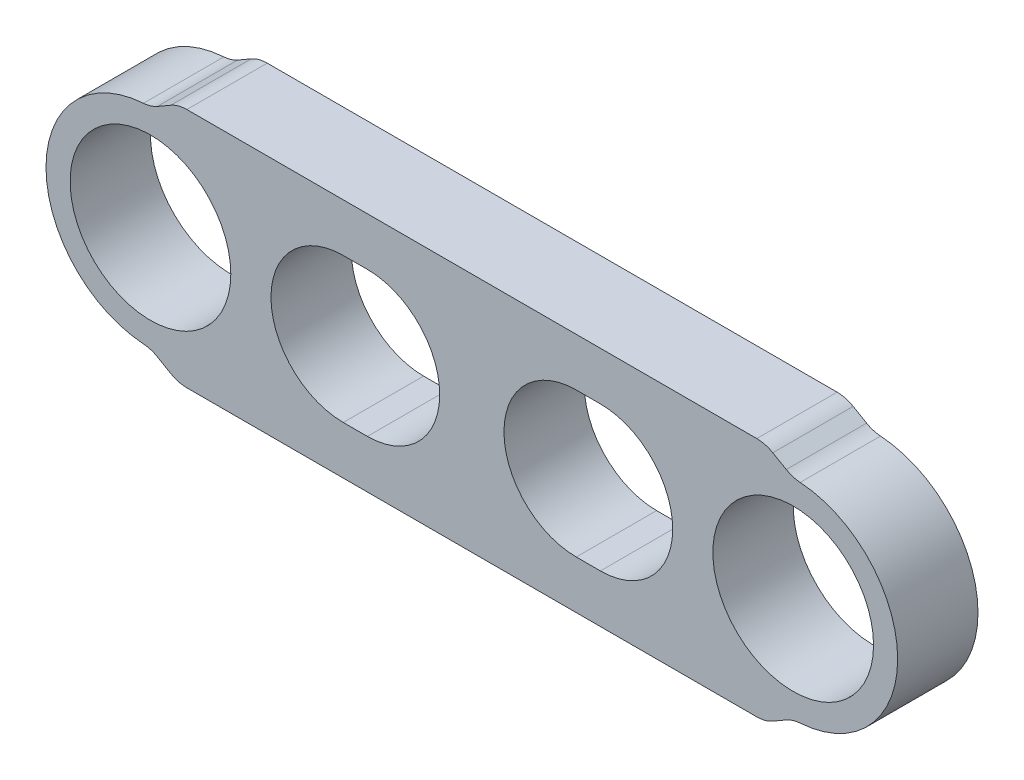
ISO-10303-21;
HEADER;
FILE_DESCRIPTION(('STEP AP214'),'2;1');
FILE_NAME('part.step','',(''),(''),'','','');
FILE_SCHEMA(('AUTOMOTIVE_DESIGN { 1 0 10303 214 1 1 1 1 }'));
ENDSEC;
DATA;
#1=APPLICATION_CONTEXT('core data for automotive mechanical design processes');
#2=APPLICATION_PROTOCOL_DEFINITION('international standard','automotive_design',2000,#1);
#3=PRODUCT_CONTEXT('',#1,'mechanical');
#4=PRODUCT('Part','Part','',(#3));
#5=PRODUCT_RELATED_PRODUCT_CATEGORY('part','',(#4));
#6=PRODUCT_DEFINITION_FORMATION('','',#4);
#7=PRODUCT_DEFINITION_CONTEXT('part definition',#1,'design');
#8=PRODUCT_DEFINITION('design','',#6,#7);
#9=PRODUCT_DEFINITION_SHAPE('','',#8);
#10=(LENGTH_UNIT() NAMED_UNIT(*) SI_UNIT(.MILLI.,.METRE.));
#11=(NAMED_UNIT(*) PLANE_ANGLE_UNIT() SI_UNIT($,.RADIAN.));
#12=(NAMED_UNIT(*) SI_UNIT($,.STERADIAN.) SOLID_ANGLE_UNIT());
#13=UNCERTAINTY_MEASURE_WITH_UNIT(LENGTH_MEASURE(1.E-05),#10,'distance_accuracy_value','');
#14=(GEOMETRIC_REPRESENTATION_CONTEXT(3) GLOBAL_UNCERTAINTY_ASSIGNED_CONTEXT((#13)) GLOBAL_UNIT_ASSIGNED_CONTEXT((#10,
#11,#12)) REPRESENTATION_CONTEXT('',''));
#15=CARTESIAN_POINT('',(0.,0.,0.));
#16=DIRECTION('',(0.,0.,1.));
#17=DIRECTION('',(1.,0.,0.));
#18=AXIS2_PLACEMENT_3D('',#15,#16,#17);
#19=CARTESIAN_POINT('',(0.,-7.5,5.));
#20=DIRECTION('',(0.,1.,0.));
#21=DIRECTION('',(0.,0.,1.));
#22=AXIS2_PLACEMENT_3D('',#19,#20,#21);
#23=PLANE('',#22);
#24=DIRECTION('',(1.,0.,0.));
#25=VECTOR('',#24,1.);
#26=CARTESIAN_POINT('',(0.,-7.5,5.));
#27=LINE('',#26,#25);
#28=CARTESIAN_POINT('',(2.26794919243111,-7.5,5.));
#29=VERTEX_POINT('',#28);
#30=CARTESIAN_POINT('',(37.7320508075689,-7.5,5.));
#31=VERTEX_POINT('',#30);
#32=EDGE_CURVE('E303',#29,#31,#27,.T.);
#33=ORIENTED_EDGE('',*,*,#32,.F.);
#34=DIRECTION('',(0.,0.,1.));
#35=VECTOR('',#34,1.);
#36=CARTESIAN_POINT('',(2.26794919243111,-7.5,0.));
#37=LINE('',#36,#35);
#38=CARTESIAN_POINT('',(2.26794919243111,-7.5,0.));
#39=VERTEX_POINT('',#38);
#40=EDGE_CURVE('E355',#29,#39,#37,.F.);
#41=ORIENTED_EDGE('',*,*,#40,.T.);
#42=DIRECTION('',(1.,0.,0.));
#43=VECTOR('',#42,1.);
#44=CARTESIAN_POINT('',(0.,-7.5,0.));
#45=LINE('',#44,#43);
#46=CARTESIAN_POINT('',(37.7320508075689,-7.5,0.));
#47=VERTEX_POINT('',#46);
#48=EDGE_CURVE('E278',#39,#47,#45,.T.);
#49=ORIENTED_EDGE('',*,*,#48,.T.);
#50=DIRECTION('',(0.,0.,1.));
#51=VECTOR('',#50,1.);
#52=CARTESIAN_POINT('',(37.7320508075689,-7.5,5.));
#53=LINE('',#52,#51);
#54=EDGE_CURVE('E352',#47,#31,#53,.T.);
#55=ORIENTED_EDGE('',*,*,#54,.T.);
#56=EDGE_LOOP('',(#33,#41,#49,#55));
#57=FACE_BOUND('',#56,.T.);
#58=ADVANCED_FACE('F44',(#57),#23,.F.);
#59=CARTESIAN_POINT('',(0.,7.5,5.));
#60=DIRECTION('',(0.,-1.,0.));
#61=DIRECTION('',(0.,0.,-1.));
#62=AXIS2_PLACEMENT_3D('',#59,#60,#61);
#63=PLANE('',#62);
#64=DIRECTION('',(-1.,0.,0.));
#65=VECTOR('',#64,1.);
#66=CARTESIAN_POINT('',(0.,7.5,5.));
#67=LINE('',#66,#65);
#68=CARTESIAN_POINT('',(37.7320508075689,7.5,5.));
#69=VERTEX_POINT('',#68);
#70=CARTESIAN_POINT('',(2.26794919243111,7.5,5.));
#71=VERTEX_POINT('',#70);
#72=EDGE_CURVE('E306',#69,#71,#67,.T.);
#73=ORIENTED_EDGE('',*,*,#72,.F.);
#74=DIRECTION('',(0.,0.,1.));
#75=VECTOR('',#74,1.);
#76=CARTESIAN_POINT('',(37.7320508075689,7.5,0.));
#77=LINE('',#76,#75);
#78=CARTESIAN_POINT('',(37.7320508075689,7.5,0.));
#79=VERTEX_POINT('',#78);
#80=EDGE_CURVE('E382',#69,#79,#77,.F.);
#81=ORIENTED_EDGE('',*,*,#80,.T.);
#82=DIRECTION('',(-1.,0.,0.));
#83=VECTOR('',#82,1.);
#84=CARTESIAN_POINT('',(0.,7.5,0.));
#85=LINE('',#84,#83);
#86=CARTESIAN_POINT('',(2.26794919243111,7.5,0.));
#87=VERTEX_POINT('',#86);
#88=EDGE_CURVE('E307',#79,#87,#85,.T.);
#89=ORIENTED_EDGE('',*,*,#88,.T.);
#90=DIRECTION('',(0.,0.,1.));
#91=VECTOR('',#90,1.);
#92=CARTESIAN_POINT('',(2.26794919243111,7.5,5.));
#93=LINE('',#92,#91);
#94=EDGE_CURVE('E379',#87,#71,#93,.T.);
#95=ORIENTED_EDGE('',*,*,#94,.T.);
#96=EDGE_LOOP('',(#73,#81,#89,#95));
#97=FACE_BOUND('',#96,.T.);
#98=ADVANCED_FACE('F438',(#97),#63,.F.);
#99=CARTESIAN_POINT('',(0.,0.,5.));
#100=DIRECTION('',(0.,0.,1.));
#101=DIRECTION('',(1.,0.,0.));
#102=AXIS2_PLACEMENT_3D('',#99,#100,#101);
#103=PLANE('',#102);
#104=CARTESIAN_POINT('',(12.,0.,5.));
#105=DIRECTION('',(0.,0.,1.));
#106=DIRECTION('',(1.,0.,0.));
#107=AXIS2_PLACEMENT_3D('',#104,#105,#106);
#108=CIRCLE('',#107,4.5);
#109=CARTESIAN_POINT('',(12.,4.5,5.));
#110=VERTEX_POINT('',#109);
#111=CARTESIAN_POINT('',(12.,-4.5,5.));
#112=VERTEX_POINT('',#111);
#113=EDGE_CURVE('E227',#110,#112,#108,.T.);
#114=ORIENTED_EDGE('',*,*,#113,.F.);
#115=DIRECTION('',(-1.,0.,0.));
#116=VECTOR('',#115,1.);
#117=CARTESIAN_POINT('',(12.,4.5,5.));
#118=LINE('',#117,#116);
#119=CARTESIAN_POINT('',(13.5,4.5,5.));
#120=VERTEX_POINT('',#119);
#121=EDGE_CURVE('E232',#120,#110,#118,.T.);
#122=ORIENTED_EDGE('',*,*,#121,.F.);
#123=CARTESIAN_POINT('',(13.5,0.,5.));
#124=DIRECTION('',(0.,0.,1.));
#125=DIRECTION('',(1.,0.,0.));
#126=AXIS2_PLACEMENT_3D('',#123,#124,#125);
#127=CIRCLE('',#126,4.5);
#128=CARTESIAN_POINT('',(13.5,-4.5,5.));
#129=VERTEX_POINT('',#128);
#130=EDGE_CURVE('E211',#129,#120,#127,.T.);
#131=ORIENTED_EDGE('',*,*,#130,.F.);
#132=DIRECTION('',(1.,0.,0.));
#133=VECTOR('',#132,1.);
#134=CARTESIAN_POINT('',(12.,-4.5,5.));
#135=LINE('',#134,#133);
#136=EDGE_CURVE('E222',#112,#129,#135,.T.);
#137=ORIENTED_EDGE('',*,*,#136,.F.);
#138=EDGE_LOOP('',(#114,#122,#131,#137));
#139=FACE_BOUND('',#138,.T.);
#140=CARTESIAN_POINT('',(28.,0.,5.));
#141=DIRECTION('',(0.,0.,1.));
#142=DIRECTION('',(-1.,0.,0.));
#143=AXIS2_PLACEMENT_3D('',#140,#141,#142);
#144=CIRCLE('',#143,4.5);
#145=CARTESIAN_POINT('',(28.,-4.5,5.));
#146=VERTEX_POINT('',#145);
#147=CARTESIAN_POINT('',(28.,4.5,5.));
#148=VERTEX_POINT('',#147);
#149=EDGE_CURVE('E260',#146,#148,#144,.T.);
#150=ORIENTED_EDGE('',*,*,#149,.F.);
#151=DIRECTION('',(1.,0.,0.));
#152=VECTOR('',#151,1.);
#153=CARTESIAN_POINT('',(28.,-4.5,5.));
#154=LINE('',#153,#152);
#155=CARTESIAN_POINT('',(26.5,-4.5,5.));
#156=VERTEX_POINT('',#155);
#157=EDGE_CURVE('E245',#156,#146,#154,.T.);
#158=ORIENTED_EDGE('',*,*,#157,.F.);
#159=CARTESIAN_POINT('',(26.5,0.,5.));
#160=DIRECTION('',(0.,0.,1.));
#161=DIRECTION('',(-1.,0.,0.));
#162=AXIS2_PLACEMENT_3D('',#159,#160,#161);
#163=CIRCLE('',#162,4.5);
#164=CARTESIAN_POINT('',(26.5,4.5,5.));
#165=VERTEX_POINT('',#164);
#166=EDGE_CURVE('E254',#165,#156,#163,.T.);
#167=ORIENTED_EDGE('',*,*,#166,.F.);
#168=DIRECTION('',(-1.,0.,0.));
#169=VECTOR('',#168,1.);
#170=CARTESIAN_POINT('',(28.,4.5,5.));
#171=LINE('',#170,#169);
#172=EDGE_CURVE('E257',#148,#165,#171,.T.);
#173=ORIENTED_EDGE('',*,*,#172,.F.);
#174=EDGE_LOOP('',(#150,#158,#167,#173));
#175=FACE_BOUND('',#174,.T.);
#176=CARTESIAN_POINT('',(0.,0.,5.));
#177=DIRECTION('',(0.,0.,1.));
#178=DIRECTION('',(1.,0.,0.));
#179=AXIS2_PLACEMENT_3D('',#176,#177,#178);
#180=CIRCLE('',#179,5.);
#181=CARTESIAN_POINT('',(5.,0.,5.));
#182=VERTEX_POINT('',#181);
#183=EDGE_CURVE('E262',#182,#182,#180,.T.);
#184=ORIENTED_EDGE('',*,*,#183,.F.);
#185=EDGE_LOOP('',(#184));
#186=FACE_BOUND('',#185,.T.);
#187=CARTESIAN_POINT('',(40.,0.,5.));
#188=DIRECTION('',(0.,0.,1.));
#189=DIRECTION('',(1.,0.,0.));
#190=AXIS2_PLACEMENT_3D('',#187,#188,#189);
#191=CIRCLE('',#190,5.);
#192=CARTESIAN_POINT('',(45.,0.,5.));
#193=VERTEX_POINT('',#192);
#194=EDGE_CURVE('E239',#193,#193,#191,.T.);
#195=ORIENTED_EDGE('',*,*,#194,.F.);
#196=EDGE_LOOP('',(#195));
#197=FACE_BOUND('',#196,.T.);
#198=DIRECTION('',(0.866025403784436,-0.500000000000005,0.));
#199=VECTOR('',#198,1.);
#200=CARTESIAN_POINT('',(-2.81458256229944,-4.87499999999997,5.));
#201=LINE('',#200,#199);
#202=CARTESIAN_POINT('',(0.431088343107263,-6.74888897093749,5.));
#203=VERTEX_POINT('',#202);
#204=CARTESIAN_POINT('',(1.2679491924311,-7.23205080756887,5.));
#205=VERTEX_POINT('',#204);
#206=EDGE_CURVE('E272',#203,#205,#201,.T.);
#207=ORIENTED_EDGE('',*,*,#206,.T.);
#208=CARTESIAN_POINT('',(2.26794919243111,-5.5,5.));
#209=DIRECTION('',(0.,0.,1.));
#210=DIRECTION('',(1.,0.,0.));
#211=AXIS2_PLACEMENT_3D('',#208,#209,#210);
#212=CIRCLE('',#211,2.);
#213=EDGE_CURVE('E350',#205,#29,#212,.T.);
#214=ORIENTED_EDGE('',*,*,#213,.T.);
#215=ORIENTED_EDGE('',*,*,#32,.T.);
#216=CARTESIAN_POINT('',(37.7320508075689,-5.5,5.));
#217=DIRECTION('',(0.,0.,1.));
#218=DIRECTION('',(1.,0.,0.));
#219=AXIS2_PLACEMENT_3D('',#216,#217,#218);
#220=CIRCLE('',#219,2.);
#221=CARTESIAN_POINT('',(38.7320508075689,-7.23205080756887,5.));
#222=VERTEX_POINT('',#221);
#223=EDGE_CURVE('E348',#31,#222,#220,.T.);
#224=ORIENTED_EDGE('',*,*,#223,.T.);
#225=DIRECTION('',(-0.866025403784436,-0.500000000000004,0.));
#226=VECTOR('',#225,1.);
#227=CARTESIAN_POINT('',(12.8145825622996,-22.1955080756888,5.));
#228=LINE('',#227,#226);
#229=CARTESIAN_POINT('',(39.5689116568927,-6.74888897093749,5.));
#230=VERTEX_POINT('',#229);
#231=EDGE_CURVE('E292',#230,#222,#228,.T.);
#232=ORIENTED_EDGE('',*,*,#231,.F.);
#233=CARTESIAN_POINT('',(40.5689116568928,-8.48093977850636,5.));
#234=DIRECTION('',(0.,0.,1.));
#235=DIRECTION('',(1.,0.,0.));
#236=AXIS2_PLACEMENT_3D('',#233,#234,#235);
#237=CIRCLE('',#236,2.);
#238=CARTESIAN_POINT('',(40.4350500905651,-6.48542453650487,5.));
#239=VERTEX_POINT('',#238);
#240=EDGE_CURVE('E394',#230,#239,#237,.F.);
#241=ORIENTED_EDGE('',*,*,#240,.T.);
#242=CARTESIAN_POINT('',(40.,0.,5.));
#243=DIRECTION('',(0.,0.,1.));
#244=DIRECTION('',(1.,0.,0.));
#245=AXIS2_PLACEMENT_3D('',#242,#243,#244);
#246=CIRCLE('',#245,6.5);
#247=CARTESIAN_POINT('',(40.4350500905651,6.48542453650487,5.));
#248=VERTEX_POINT('',#247);
#249=EDGE_CURVE('E298',#248,#239,#246,.F.);
#250=ORIENTED_EDGE('',*,*,#249,.F.);
#251=CARTESIAN_POINT('',(40.5689116568928,8.48093977850636,5.));
#252=DIRECTION('',(0.,0.,1.));
#253=DIRECTION('',(1.,0.,0.));
#254=AXIS2_PLACEMENT_3D('',#251,#252,#253);
#255=CIRCLE('',#254,2.);
#256=CARTESIAN_POINT('',(39.5689116568927,6.74888897093749,5.));
#257=VERTEX_POINT('',#256);
#258=EDGE_CURVE('E397',#248,#257,#255,.F.);
#259=ORIENTED_EDGE('',*,*,#258,.T.);
#260=DIRECTION('',(-0.866025403784436,0.500000000000004,0.));
#261=VECTOR('',#260,1.);
#262=CARTESIAN_POINT('',(12.8145825622996,22.1955080756888,5.));
#263=LINE('',#262,#261);
#264=CARTESIAN_POINT('',(38.7320508075689,7.23205080756888,5.));
#265=VERTEX_POINT('',#264);
#266=EDGE_CURVE('E295',#257,#265,#263,.T.);
#267=ORIENTED_EDGE('',*,*,#266,.T.);
#268=CARTESIAN_POINT('',(37.7320508075689,5.5,5.));
#269=DIRECTION('',(0.,0.,1.));
#270=DIRECTION('',(1.,0.,0.));
#271=AXIS2_PLACEMENT_3D('',#268,#269,#270);
#272=CIRCLE('',#271,2.);
#273=EDGE_CURVE('E346',#265,#69,#272,.T.);
#274=ORIENTED_EDGE('',*,*,#273,.T.);
#275=ORIENTED_EDGE('',*,*,#72,.T.);
#276=CARTESIAN_POINT('',(2.26794919243111,5.5,5.));
#277=DIRECTION('',(0.,0.,1.));
#278=DIRECTION('',(1.,0.,0.));
#279=AXIS2_PLACEMENT_3D('',#276,#277,#278);
#280=CIRCLE('',#279,2.);
#281=CARTESIAN_POINT('',(1.2679491924311,7.23205080756887,5.));
#282=VERTEX_POINT('',#281);
#283=EDGE_CURVE('E344',#71,#282,#280,.T.);
#284=ORIENTED_EDGE('',*,*,#283,.T.);
#285=DIRECTION('',(0.866025403784436,0.500000000000005,0.));
#286=VECTOR('',#285,1.);
#287=CARTESIAN_POINT('',(-2.81458256229944,4.87499999999997,5.));
#288=LINE('',#287,#286);
#289=CARTESIAN_POINT('',(0.431088343107263,6.74888897093749,5.));
#290=VERTEX_POINT('',#289);
#291=EDGE_CURVE('E282',#290,#282,#288,.T.);
#292=ORIENTED_EDGE('',*,*,#291,.F.);
#293=CARTESIAN_POINT('',(-0.568911656892749,8.48093977850636,5.));
#294=DIRECTION('',(0.,0.,1.));
#295=DIRECTION('',(1.,0.,0.));
#296=AXIS2_PLACEMENT_3D('',#293,#294,#295);
#297=CIRCLE('',#296,2.);
#298=CARTESIAN_POINT('',(-0.435050090565043,6.48542453650487,5.));
#299=VERTEX_POINT('',#298);
#300=EDGE_CURVE('E401',#290,#299,#297,.F.);
#301=ORIENTED_EDGE('',*,*,#300,.T.);
#302=CARTESIAN_POINT('',(0.,0.,5.));
#303=DIRECTION('',(0.,0.,1.));
#304=DIRECTION('',(1.,0.,0.));
#305=AXIS2_PLACEMENT_3D('',#302,#303,#304);
#306=CIRCLE('',#305,6.5);
#307=CARTESIAN_POINT('',(-0.435050090565043,-6.48542453650487,5.));
#308=VERTEX_POINT('',#307);
#309=EDGE_CURVE('E279',#299,#308,#306,.T.);
#310=ORIENTED_EDGE('',*,*,#309,.T.);
#311=CARTESIAN_POINT('',(-0.568911656892749,-8.48093977850636,5.));
#312=DIRECTION('',(0.,0.,1.));
#313=DIRECTION('',(1.,0.,0.));
#314=AXIS2_PLACEMENT_3D('',#311,#312,#313);
#315=CIRCLE('',#314,2.);
#316=EDGE_CURVE('E52',#308,#203,#315,.F.);
#317=ORIENTED_EDGE('',*,*,#316,.T.);
#318=EDGE_LOOP('',(#207,#214,#215,#224,#232,#241,#250,#259,#267,#274,#275,#284,#292,#301,#310,#317));
#319=FACE_BOUND('',#318,.T.);
#320=ADVANCED_FACE('F229',(#139,#175,#186,#197,#319),#103,.T.);
#321=CARTESIAN_POINT('',(0.,0.,0.));
#322=DIRECTION('',(0.,0.,1.));
#323=DIRECTION('',(1.,0.,0.));
#324=AXIS2_PLACEMENT_3D('',#321,#322,#323);
#325=PLANE('',#324);
#326=DIRECTION('',(-1.,0.,0.));
#327=VECTOR('',#326,1.);
#328=CARTESIAN_POINT('',(0.,4.5,0.));
#329=LINE('',#328,#327);
#330=CARTESIAN_POINT('',(13.5,4.5,0.));
#331=VERTEX_POINT('',#330);
#332=CARTESIAN_POINT('',(12.,4.5,0.));
#333=VERTEX_POINT('',#332);
#334=EDGE_CURVE('E333',#331,#333,#329,.T.);
#335=ORIENTED_EDGE('',*,*,#334,.T.);
#336=CARTESIAN_POINT('',(12.,0.,0.));
#337=DIRECTION('',(0.,0.,1.));
#338=DIRECTION('',(1.,0.,0.));
#339=AXIS2_PLACEMENT_3D('',#336,#337,#338);
#340=CIRCLE('',#339,4.5);
#341=CARTESIAN_POINT('',(12.,-4.5,0.));
#342=VERTEX_POINT('',#341);
#343=EDGE_CURVE('E336',#333,#342,#340,.T.);
#344=ORIENTED_EDGE('',*,*,#343,.T.);
#345=DIRECTION('',(1.,0.,0.));
#346=VECTOR('',#345,1.);
#347=CARTESIAN_POINT('',(0.,-4.5,0.));
#348=LINE('',#347,#346);
#349=CARTESIAN_POINT('',(13.5,-4.5,0.));
#350=VERTEX_POINT('',#349);
#351=EDGE_CURVE('E330',#342,#350,#348,.T.);
#352=ORIENTED_EDGE('',*,*,#351,.T.);
#353=CARTESIAN_POINT('',(13.5,0.,0.));
#354=DIRECTION('',(0.,0.,1.));
#355=DIRECTION('',(1.,0.,0.));
#356=AXIS2_PLACEMENT_3D('',#353,#354,#355);
#357=CIRCLE('',#356,4.5);
#358=EDGE_CURVE('E214',#350,#331,#357,.T.);
#359=ORIENTED_EDGE('',*,*,#358,.T.);
#360=EDGE_LOOP('',(#335,#344,#352,#359));
#361=FACE_BOUND('',#360,.T.);
#362=DIRECTION('',(1.,0.,0.));
#363=VECTOR('',#362,1.);
#364=CARTESIAN_POINT('',(0.,-4.5,0.));
#365=LINE('',#364,#363);
#366=CARTESIAN_POINT('',(26.5,-4.5,0.));
#367=VERTEX_POINT('',#366);
#368=CARTESIAN_POINT('',(28.,-4.5,0.));
#369=VERTEX_POINT('',#368);
#370=EDGE_CURVE('E324',#367,#369,#365,.T.);
#371=ORIENTED_EDGE('',*,*,#370,.T.);
#372=CARTESIAN_POINT('',(28.,0.,0.));
#373=DIRECTION('',(0.,0.,1.));
#374=DIRECTION('',(1.,0.,0.));
#375=AXIS2_PLACEMENT_3D('',#372,#373,#374);
#376=CIRCLE('',#375,4.5);
#377=CARTESIAN_POINT('',(28.,4.5,0.));
#378=VERTEX_POINT('',#377);
#379=EDGE_CURVE('E327',#369,#378,#376,.T.);
#380=ORIENTED_EDGE('',*,*,#379,.T.);
#381=DIRECTION('',(-1.,0.,0.));
#382=VECTOR('',#381,1.);
#383=CARTESIAN_POINT('',(0.,4.5,0.));
#384=LINE('',#383,#382);
#385=CARTESIAN_POINT('',(26.5,4.5,0.));
#386=VERTEX_POINT('',#385);
#387=EDGE_CURVE('E310',#378,#386,#384,.T.);
#388=ORIENTED_EDGE('',*,*,#387,.T.);
#389=CARTESIAN_POINT('',(26.5,0.,0.));
#390=DIRECTION('',(0.,0.,1.));
#391=DIRECTION('',(1.,0.,0.));
#392=AXIS2_PLACEMENT_3D('',#389,#390,#391);
#393=CIRCLE('',#392,4.5);
#394=EDGE_CURVE('E321',#386,#367,#393,.T.);
#395=ORIENTED_EDGE('',*,*,#394,.T.);
#396=EDGE_LOOP('',(#371,#380,#388,#395));
#397=FACE_BOUND('',#396,.T.);
#398=CARTESIAN_POINT('',(0.,0.,0.));
#399=DIRECTION('',(0.,0.,1.));
#400=DIRECTION('',(1.,0.,0.));
#401=AXIS2_PLACEMENT_3D('',#398,#399,#400);
#402=CIRCLE('',#401,5.);
#403=CARTESIAN_POINT('',(5.,0.,0.));
#404=VERTEX_POINT('',#403);
#405=EDGE_CURVE('E299',#404,#404,#402,.T.);
#406=ORIENTED_EDGE('',*,*,#405,.T.);
#407=EDGE_LOOP('',(#406));
#408=FACE_BOUND('',#407,.T.);
#409=CARTESIAN_POINT('',(40.,0.,0.));
#410=DIRECTION('',(0.,0.,1.));
#411=DIRECTION('',(1.,0.,0.));
#412=AXIS2_PLACEMENT_3D('',#409,#410,#411);
#413=CIRCLE('',#412,5.);
#414=CARTESIAN_POINT('',(45.,0.,0.));
#415=VERTEX_POINT('',#414);
#416=EDGE_CURVE('E265',#415,#415,#413,.T.);
#417=ORIENTED_EDGE('',*,*,#416,.T.);
#418=EDGE_LOOP('',(#417));
#419=FACE_BOUND('',#418,.T.);
#420=ORIENTED_EDGE('',*,*,#48,.F.);
#421=CARTESIAN_POINT('',(2.26794919243111,-5.5,0.));
#422=DIRECTION('',(0.,0.,1.));
#423=DIRECTION('',(1.,0.,0.));
#424=AXIS2_PLACEMENT_3D('',#421,#422,#423);
#425=CIRCLE('',#424,2.);
#426=CARTESIAN_POINT('',(1.2679491924311,-7.23205080756887,0.));
#427=VERTEX_POINT('',#426);
#428=EDGE_CURVE('E363',#39,#427,#425,.F.);
#429=ORIENTED_EDGE('',*,*,#428,.T.);
#430=DIRECTION('',(0.866025403784436,-0.500000000000005,0.));
#431=VECTOR('',#430,1.);
#432=CARTESIAN_POINT('',(-2.81458256229944,-4.87499999999997,0.));
#433=LINE('',#432,#431);
#434=CARTESIAN_POINT('',(0.431088343107263,-6.74888897093749,0.));
#435=VERTEX_POINT('',#434);
#436=EDGE_CURVE('E275',#435,#427,#433,.T.);
#437=ORIENTED_EDGE('',*,*,#436,.F.);
#438=CARTESIAN_POINT('',(-0.568911656892749,-8.48093977850636,0.));
#439=DIRECTION('',(0.,0.,1.));
#440=DIRECTION('',(1.,0.,0.));
#441=AXIS2_PLACEMENT_3D('',#438,#439,#440);
#442=CIRCLE('',#441,2.);
#443=CARTESIAN_POINT('',(-0.435050090565043,-6.48542453650487,0.));
#444=VERTEX_POINT('',#443);
#445=EDGE_CURVE('E11',#435,#444,#442,.T.);
#446=ORIENTED_EDGE('',*,*,#445,.T.);
#447=CARTESIAN_POINT('',(0.,0.,0.));
#448=DIRECTION('',(0.,0.,1.));
#449=DIRECTION('',(1.,0.,0.));
#450=AXIS2_PLACEMENT_3D('',#447,#448,#449);
#451=CIRCLE('',#450,6.5);
#452=CARTESIAN_POINT('',(-0.435050090565043,6.48542453650487,0.));
#453=VERTEX_POINT('',#452);
#454=EDGE_CURVE('E268',#453,#444,#451,.T.);
#455=ORIENTED_EDGE('',*,*,#454,.F.);
#456=CARTESIAN_POINT('',(-0.568911656892749,8.48093977850636,0.));
#457=DIRECTION('',(0.,0.,1.));
#458=DIRECTION('',(1.,0.,0.));
#459=AXIS2_PLACEMENT_3D('',#456,#457,#458);
#460=CIRCLE('',#459,2.);
#461=CARTESIAN_POINT('',(0.431088343107263,6.74888897093749,0.));
#462=VERTEX_POINT('',#461);
#463=EDGE_CURVE('E403',#453,#462,#460,.T.);
#464=ORIENTED_EDGE('',*,*,#463,.T.);
#465=DIRECTION('',(0.866025403784436,0.500000000000005,0.));
#466=VECTOR('',#465,1.);
#467=CARTESIAN_POINT('',(-2.81458256229944,4.87499999999997,0.));
#468=LINE('',#467,#466);
#469=CARTESIAN_POINT('',(1.2679491924311,7.23205080756887,0.));
#470=VERTEX_POINT('',#469);
#471=EDGE_CURVE('E271',#462,#470,#468,.T.);
#472=ORIENTED_EDGE('',*,*,#471,.T.);
#473=CARTESIAN_POINT('',(2.26794919243111,5.5,0.));
#474=DIRECTION('',(0.,0.,1.));
#475=DIRECTION('',(1.,0.,0.));
#476=AXIS2_PLACEMENT_3D('',#473,#474,#475);
#477=CIRCLE('',#476,2.);
#478=EDGE_CURVE('E357',#470,#87,#477,.F.);
#479=ORIENTED_EDGE('',*,*,#478,.T.);
#480=ORIENTED_EDGE('',*,*,#88,.F.);
#481=CARTESIAN_POINT('',(37.7320508075689,5.5,0.));
#482=DIRECTION('',(0.,0.,1.));
#483=DIRECTION('',(1.,0.,0.));
#484=AXIS2_PLACEMENT_3D('',#481,#482,#483);
#485=CIRCLE('',#484,2.);
#486=CARTESIAN_POINT('',(38.7320508075689,7.23205080756888,0.));
#487=VERTEX_POINT('',#486);
#488=EDGE_CURVE('E359',#79,#487,#485,.F.);
#489=ORIENTED_EDGE('',*,*,#488,.T.);
#490=DIRECTION('',(-0.866025403784436,0.500000000000004,0.));
#491=VECTOR('',#490,1.);
#492=CARTESIAN_POINT('',(12.8145825622996,22.1955080756888,0.));
#493=LINE('',#492,#491);
#494=CARTESIAN_POINT('',(39.5689116568927,6.74888897093749,0.));
#495=VERTEX_POINT('',#494);
#496=EDGE_CURVE('E288',#495,#487,#493,.T.);
#497=ORIENTED_EDGE('',*,*,#496,.F.);
#498=CARTESIAN_POINT('',(40.5689116568928,8.48093977850636,0.));
#499=DIRECTION('',(0.,0.,1.));
#500=DIRECTION('',(1.,0.,0.));
#501=AXIS2_PLACEMENT_3D('',#498,#499,#500);
#502=CIRCLE('',#501,2.);
#503=CARTESIAN_POINT('',(40.4350500905651,6.48542453650487,0.));
#504=VERTEX_POINT('',#503);
#505=EDGE_CURVE('E399',#495,#504,#502,.T.);
#506=ORIENTED_EDGE('',*,*,#505,.T.);
#507=CARTESIAN_POINT('',(40.,0.,0.));
#508=DIRECTION('',(0.,0.,1.));
#509=DIRECTION('',(1.,0.,0.));
#510=AXIS2_PLACEMENT_3D('',#507,#508,#509);
#511=CIRCLE('',#510,6.5);
#512=CARTESIAN_POINT('',(40.4350500905651,-6.48542453650487,0.));
#513=VERTEX_POINT('',#512);
#514=EDGE_CURVE('E291',#504,#513,#511,.F.);
#515=ORIENTED_EDGE('',*,*,#514,.T.);
#516=CARTESIAN_POINT('',(40.5689116568928,-8.48093977850636,0.));
#517=DIRECTION('',(0.,0.,1.));
#518=DIRECTION('',(1.,0.,0.));
#519=AXIS2_PLACEMENT_3D('',#516,#517,#518);
#520=CIRCLE('',#519,2.);
#521=CARTESIAN_POINT('',(39.5689116568927,-6.74888897093749,0.));
#522=VERTEX_POINT('',#521);
#523=EDGE_CURVE('E66',#513,#522,#520,.T.);
#524=ORIENTED_EDGE('',*,*,#523,.T.);
#525=DIRECTION('',(-0.866025403784436,-0.500000000000004,0.));
#526=VECTOR('',#525,1.);
#527=CARTESIAN_POINT('',(12.8145825622996,-22.1955080756888,0.));
#528=LINE('',#527,#526);
#529=CARTESIAN_POINT('',(38.7320508075689,-7.23205080756887,0.));
#530=VERTEX_POINT('',#529);
#531=EDGE_CURVE('E283',#522,#530,#528,.T.);
#532=ORIENTED_EDGE('',*,*,#531,.T.);
#533=CARTESIAN_POINT('',(37.7320508075689,-5.5,0.));
#534=DIRECTION('',(0.,0.,1.));
#535=DIRECTION('',(1.,0.,0.));
#536=AXIS2_PLACEMENT_3D('',#533,#534,#535);
#537=CIRCLE('',#536,2.);
#538=EDGE_CURVE('E361',#530,#47,#537,.F.);
#539=ORIENTED_EDGE('',*,*,#538,.T.);
#540=EDGE_LOOP('',(#420,#429,#437,#446,#455,#464,#472,#479,#480,#489,#497,#506,#515,#524,#532,#539));
#541=FACE_BOUND('',#540,.T.);
#542=ADVANCED_FACE('F418',(#361,#397,#408,#419,#541),#325,.F.);
#543=CARTESIAN_POINT('',(12.8145825622996,22.1955080756888,0.));
#544=DIRECTION('',(0.500000000000004,0.866025403784436,0.));
#545=DIRECTION('',(-0.866025403784436,0.500000000000004,0.));
#546=AXIS2_PLACEMENT_3D('',#543,#544,#545);
#547=PLANE('',#546);
#548=ORIENTED_EDGE('',*,*,#266,.F.);
#549=DIRECTION('',(0.,0.,1.));
#550=VECTOR('',#549,1.);
#551=CARTESIAN_POINT('',(39.5689116568928,6.74888897093749,0.));
#552=LINE('',#551,#550);
#553=EDGE_CURVE('E377',#257,#495,#552,.F.);
#554=ORIENTED_EDGE('',*,*,#553,.T.);
#555=ORIENTED_EDGE('',*,*,#496,.T.);
#556=DIRECTION('',(0.,0.,1.));
#557=VECTOR('',#556,1.);
#558=CARTESIAN_POINT('',(38.7320508075689,7.23205080756887,5.));
#559=LINE('',#558,#557);
#560=EDGE_CURVE('E374',#487,#265,#559,.T.);
#561=ORIENTED_EDGE('',*,*,#560,.T.);
#562=EDGE_LOOP('',(#548,#554,#555,#561));
#563=FACE_BOUND('',#562,.T.);
#564=ADVANCED_FACE('F447',(#563),#547,.T.);
#565=CARTESIAN_POINT('',(12.8145825622996,-22.1955080756888,0.));
#566=DIRECTION('',(-0.500000000000004,0.866025403784436,0.));
#567=DIRECTION('',(-0.866025403784436,-0.500000000000004,0.));
#568=AXIS2_PLACEMENT_3D('',#565,#566,#567);
#569=PLANE('',#568);
#570=ORIENTED_EDGE('',*,*,#231,.T.);
#571=DIRECTION('',(0.,0.,1.));
#572=VECTOR('',#571,1.);
#573=CARTESIAN_POINT('',(38.7320508075689,-7.23205080756887,0.));
#574=LINE('',#573,#572);
#575=EDGE_CURVE('E59',#222,#530,#574,.F.);
#576=ORIENTED_EDGE('',*,*,#575,.T.);
#577=ORIENTED_EDGE('',*,*,#531,.F.);
#578=DIRECTION('',(0.,0.,-1.));
#579=VECTOR('',#578,1.);
#580=CARTESIAN_POINT('',(39.5689116568928,-6.74888897093749,5.));
#581=LINE('',#580,#579);
#582=EDGE_CURVE('E365',#522,#230,#581,.F.);
#583=ORIENTED_EDGE('',*,*,#582,.T.);
#584=EDGE_LOOP('',(#570,#576,#577,#583));
#585=FACE_BOUND('',#584,.T.);
#586=ADVANCED_FACE('F461',(#585),#569,.F.);
#587=CARTESIAN_POINT('',(40.,0.,0.));
#588=DIRECTION('',(0.,0.,1.));
#589=DIRECTION('',(1.,0.,0.));
#590=AXIS2_PLACEMENT_3D('',#587,#588,#589);
#591=CYLINDRICAL_SURFACE('',#590,6.5);
#592=ORIENTED_EDGE('',*,*,#249,.T.);
#593=DIRECTION('',(0.,0.,1.));
#594=VECTOR('',#593,1.);
#595=CARTESIAN_POINT('',(40.4350500905651,-6.48542453650487,0.));
#596=LINE('',#595,#594);
#597=EDGE_CURVE('E372',#239,#513,#596,.F.);
#598=ORIENTED_EDGE('',*,*,#597,.T.);
#599=ORIENTED_EDGE('',*,*,#514,.F.);
#600=DIRECTION('',(0.,0.,1.));
#601=VECTOR('',#600,1.);
#602=CARTESIAN_POINT('',(40.4350500905651,6.48542453650487,0.));
#603=LINE('',#602,#601);
#604=EDGE_CURVE('E369',#504,#248,#603,.T.);
#605=ORIENTED_EDGE('',*,*,#604,.T.);
#606=EDGE_LOOP('',(#592,#598,#599,#605));
#607=FACE_BOUND('',#606,.T.);
#608=ADVANCED_FACE('F454',(#607),#591,.T.);
#609=CARTESIAN_POINT('',(0.,0.,0.));
#610=DIRECTION('',(0.,0.,1.));
#611=DIRECTION('',(1.,0.,0.));
#612=AXIS2_PLACEMENT_3D('',#609,#610,#611);
#613=CYLINDRICAL_SURFACE('',#612,6.5);
#614=ORIENTED_EDGE('',*,*,#309,.F.);
#615=DIRECTION('',(0.,0.,1.));
#616=VECTOR('',#615,1.);
#617=CARTESIAN_POINT('',(-0.435050090565043,6.48542453650487,0.));
#618=LINE('',#617,#616);
#619=EDGE_CURVE('E392',#299,#453,#618,.F.);
#620=ORIENTED_EDGE('',*,*,#619,.T.);
#621=ORIENTED_EDGE('',*,*,#454,.T.);
#622=DIRECTION('',(0.,0.,1.));
#623=VECTOR('',#622,1.);
#624=CARTESIAN_POINT('',(-0.435050090565043,-6.48542453650487,0.));
#625=LINE('',#624,#623);
#626=EDGE_CURVE('E389',#444,#308,#625,.T.);
#627=ORIENTED_EDGE('',*,*,#626,.T.);
#628=EDGE_LOOP('',(#614,#620,#621,#627));
#629=FACE_BOUND('',#628,.T.);
#630=ADVANCED_FACE('F421',(#629),#613,.T.);
#631=CARTESIAN_POINT('',(-2.81458256229944,-4.87499999999997,0.));
#632=DIRECTION('',(-0.500000000000004,-0.866025403784436,0.));
#633=DIRECTION('',(0.866025403784436,-0.500000000000004,0.));
#634=AXIS2_PLACEMENT_3D('',#631,#632,#633);
#635=PLANE('',#634);
#636=ORIENTED_EDGE('',*,*,#436,.T.);
#637=DIRECTION('',(0.,0.,1.));
#638=VECTOR('',#637,1.);
#639=CARTESIAN_POINT('',(1.2679491924311,-7.23205080756887,5.));
#640=LINE('',#639,#638);
#641=EDGE_CURVE('E341',#427,#205,#640,.T.);
#642=ORIENTED_EDGE('',*,*,#641,.T.);
#643=ORIENTED_EDGE('',*,*,#206,.F.);
#644=DIRECTION('',(0.,0.,-1.));
#645=VECTOR('',#644,1.);
#646=CARTESIAN_POINT('',(0.431088343107261,-6.74888897093749,0.));
#647=LINE('',#646,#645);
#648=EDGE_CURVE('E339',#203,#435,#647,.T.);
#649=ORIENTED_EDGE('',*,*,#648,.T.);
#650=EDGE_LOOP('',(#636,#642,#643,#649));
#651=FACE_BOUND('',#650,.T.);
#652=ADVANCED_FACE('F411',(#651),#635,.T.);
#653=CARTESIAN_POINT('',(-2.81458256229944,4.87499999999997,0.));
#654=DIRECTION('',(0.500000000000004,-0.866025403784436,0.));
#655=DIRECTION('',(0.866025403784436,0.500000000000004,0.));
#656=AXIS2_PLACEMENT_3D('',#653,#654,#655);
#657=PLANE('',#656);
#658=ORIENTED_EDGE('',*,*,#471,.F.);
#659=DIRECTION('',(0.,0.,1.));
#660=VECTOR('',#659,1.);
#661=CARTESIAN_POINT('',(0.431088343107261,6.74888897093749,0.));
#662=LINE('',#661,#660);
#663=EDGE_CURVE('E386',#462,#290,#662,.T.);
#664=ORIENTED_EDGE('',*,*,#663,.T.);
#665=ORIENTED_EDGE('',*,*,#291,.T.);
#666=DIRECTION('',(0.,0.,1.));
#667=VECTOR('',#666,1.);
#668=CARTESIAN_POINT('',(1.2679491924311,7.23205080756887,0.));
#669=LINE('',#668,#667);
#670=EDGE_CURVE('E384',#282,#470,#669,.F.);
#671=ORIENTED_EDGE('',*,*,#670,.T.);
#672=EDGE_LOOP('',(#658,#664,#665,#671));
#673=FACE_BOUND('',#672,.T.);
#674=ADVANCED_FACE('F429',(#673),#657,.F.);
#675=CARTESIAN_POINT('',(40.,0.,-1.));
#676=DIRECTION('',(0.,0.,1.));
#677=DIRECTION('',(1.,0.,0.));
#678=AXIS2_PLACEMENT_3D('',#675,#676,#677);
#679=CYLINDRICAL_SURFACE('',#678,5.);
#680=ORIENTED_EDGE('',*,*,#194,.T.);
#681=EDGE_LOOP('',(#680));
#682=FACE_BOUND('',#681,.T.);
#683=ORIENTED_EDGE('',*,*,#416,.F.);
#684=EDGE_LOOP('',(#683));
#685=FACE_BOUND('',#684,.T.);
#686=ADVANCED_FACE('F502',(#682,#685),#679,.F.);
#687=CARTESIAN_POINT('',(0.,0.,-1.));
#688=DIRECTION('',(0.,0.,1.));
#689=DIRECTION('',(1.,0.,0.));
#690=AXIS2_PLACEMENT_3D('',#687,#688,#689);
#691=CYLINDRICAL_SURFACE('',#690,5.);
#692=ORIENTED_EDGE('',*,*,#183,.T.);
#693=EDGE_LOOP('',(#692));
#694=FACE_BOUND('',#693,.T.);
#695=ORIENTED_EDGE('',*,*,#405,.F.);
#696=EDGE_LOOP('',(#695));
#697=FACE_BOUND('',#696,.T.);
#698=ADVANCED_FACE('F507',(#694,#697),#691,.F.);
#699=CARTESIAN_POINT('',(28.,0.,-5.));
#700=DIRECTION('',(0.,0.,1.));
#701=DIRECTION('',(1.,0.,0.));
#702=AXIS2_PLACEMENT_3D('',#699,#700,#701);
#703=CYLINDRICAL_SURFACE('',#702,4.5);
#704=DIRECTION('',(0.,0.,1.));
#705=VECTOR('',#704,1.);
#706=CARTESIAN_POINT('',(28.,-4.5,-5.));
#707=LINE('',#706,#705);
#708=EDGE_CURVE('E250',#369,#146,#707,.T.);
#709=ORIENTED_EDGE('',*,*,#708,.T.);
#710=ORIENTED_EDGE('',*,*,#149,.T.);
#711=DIRECTION('',(0.,0.,1.));
#712=VECTOR('',#711,1.);
#713=CARTESIAN_POINT('',(28.,4.5,-5.));
#714=LINE('',#713,#712);
#715=EDGE_CURVE('E242',#378,#148,#714,.T.);
#716=ORIENTED_EDGE('',*,*,#715,.F.);
#717=ORIENTED_EDGE('',*,*,#379,.F.);
#718=EDGE_LOOP('',(#709,#710,#716,#717));
#719=FACE_BOUND('',#718,.T.);
#720=ADVANCED_FACE('F511',(#719),#703,.F.);
#721=CARTESIAN_POINT('',(28.,-4.5,-5.));
#722=DIRECTION('',(0.,-1.,0.));
#723=DIRECTION('',(0.,0.,-1.));
#724=AXIS2_PLACEMENT_3D('',#721,#722,#723);
#725=PLANE('',#724);
#726=DIRECTION('',(0.,0.,1.));
#727=VECTOR('',#726,1.);
#728=CARTESIAN_POINT('',(26.5,-4.5,-5.));
#729=LINE('',#728,#727);
#730=EDGE_CURVE('E248',#367,#156,#729,.T.);
#731=ORIENTED_EDGE('',*,*,#730,.T.);
#732=ORIENTED_EDGE('',*,*,#157,.T.);
#733=ORIENTED_EDGE('',*,*,#708,.F.);
#734=ORIENTED_EDGE('',*,*,#370,.F.);
#735=EDGE_LOOP('',(#731,#732,#733,#734));
#736=FACE_BOUND('',#735,.T.);
#737=ADVANCED_FACE('F513',(#736),#725,.F.);
#738=CARTESIAN_POINT('',(26.5,0.,-5.));
#739=DIRECTION('',(0.,0.,1.));
#740=DIRECTION('',(1.,0.,0.));
#741=AXIS2_PLACEMENT_3D('',#738,#739,#740);
#742=CYLINDRICAL_SURFACE('',#741,4.5);
#743=DIRECTION('',(0.,0.,1.));
#744=VECTOR('',#743,1.);
#745=CARTESIAN_POINT('',(26.5,4.5,-5.));
#746=LINE('',#745,#744);
#747=EDGE_CURVE('E246',#386,#165,#746,.T.);
#748=ORIENTED_EDGE('',*,*,#747,.T.);
#749=ORIENTED_EDGE('',*,*,#166,.T.);
#750=ORIENTED_EDGE('',*,*,#730,.F.);
#751=ORIENTED_EDGE('',*,*,#394,.F.);
#752=EDGE_LOOP('',(#748,#749,#750,#751));
#753=FACE_BOUND('',#752,.T.);
#754=ADVANCED_FACE('F516',(#753),#742,.F.);
#755=CARTESIAN_POINT('',(28.,4.5,-5.));
#756=DIRECTION('',(0.,1.,0.));
#757=DIRECTION('',(0.,0.,1.));
#758=AXIS2_PLACEMENT_3D('',#755,#756,#757);
#759=PLANE('',#758);
#760=ORIENTED_EDGE('',*,*,#715,.T.);
#761=ORIENTED_EDGE('',*,*,#172,.T.);
#762=ORIENTED_EDGE('',*,*,#747,.F.);
#763=ORIENTED_EDGE('',*,*,#387,.F.);
#764=EDGE_LOOP('',(#760,#761,#762,#763));
#765=FACE_BOUND('',#764,.T.);
#766=ADVANCED_FACE('F520',(#765),#759,.F.);
#767=CARTESIAN_POINT('',(12.,0.,-5.));
#768=DIRECTION('',(0.,0.,1.));
#769=DIRECTION('',(1.,0.,0.));
#770=AXIS2_PLACEMENT_3D('',#767,#768,#769);
#771=CYLINDRICAL_SURFACE('',#770,4.5);
#772=DIRECTION('',(0.,0.,1.));
#773=VECTOR('',#772,1.);
#774=CARTESIAN_POINT('',(12.,4.5,-5.));
#775=LINE('',#774,#773);
#776=EDGE_CURVE('E237',#333,#110,#775,.T.);
#777=ORIENTED_EDGE('',*,*,#776,.T.);
#778=ORIENTED_EDGE('',*,*,#113,.T.);
#779=DIRECTION('',(0.,0.,1.));
#780=VECTOR('',#779,1.);
#781=CARTESIAN_POINT('',(12.,-4.5,-5.));
#782=LINE('',#781,#780);
#783=EDGE_CURVE('E218',#342,#112,#782,.T.);
#784=ORIENTED_EDGE('',*,*,#783,.F.);
#785=ORIENTED_EDGE('',*,*,#343,.F.);
#786=EDGE_LOOP('',(#777,#778,#784,#785));
#787=FACE_BOUND('',#786,.T.);
#788=ADVANCED_FACE('F524',(#787),#771,.F.);
#789=CARTESIAN_POINT('',(12.,4.5,-5.));
#790=DIRECTION('',(0.,1.,0.));
#791=DIRECTION('',(0.,0.,1.));
#792=AXIS2_PLACEMENT_3D('',#789,#790,#791);
#793=PLANE('',#792);
#794=DIRECTION('',(0.,0.,1.));
#795=VECTOR('',#794,1.);
#796=CARTESIAN_POINT('',(13.5,4.5,-5.));
#797=LINE('',#796,#795);
#798=EDGE_CURVE('E217',#331,#120,#797,.T.);
#799=ORIENTED_EDGE('',*,*,#798,.T.);
#800=ORIENTED_EDGE('',*,*,#121,.T.);
#801=ORIENTED_EDGE('',*,*,#776,.F.);
#802=ORIENTED_EDGE('',*,*,#334,.F.);
#803=EDGE_LOOP('',(#799,#800,#801,#802));
#804=FACE_BOUND('',#803,.T.);
#805=ADVANCED_FACE('F530',(#804),#793,.F.);
#806=CARTESIAN_POINT('',(13.5,0.,-5.));
#807=DIRECTION('',(0.,0.,1.));
#808=DIRECTION('',(1.,0.,0.));
#809=AXIS2_PLACEMENT_3D('',#806,#807,#808);
#810=CYLINDRICAL_SURFACE('',#809,4.5);
#811=DIRECTION('',(0.,0.,1.));
#812=VECTOR('',#811,1.);
#813=CARTESIAN_POINT('',(13.5,-4.5,-5.));
#814=LINE('',#813,#812);
#815=EDGE_CURVE('E206',#350,#129,#814,.T.);
#816=ORIENTED_EDGE('',*,*,#815,.T.);
#817=ORIENTED_EDGE('',*,*,#130,.T.);
#818=ORIENTED_EDGE('',*,*,#798,.F.);
#819=ORIENTED_EDGE('',*,*,#358,.F.);
#820=EDGE_LOOP('',(#816,#817,#818,#819));
#821=FACE_BOUND('',#820,.T.);
#822=ADVANCED_FACE('F208',(#821),#810,.F.);
#823=CARTESIAN_POINT('',(12.,-4.5,-5.));
#824=DIRECTION('',(0.,-1.,0.));
#825=DIRECTION('',(0.,0.,-1.));
#826=AXIS2_PLACEMENT_3D('',#823,#824,#825);
#827=PLANE('',#826);
#828=ORIENTED_EDGE('',*,*,#783,.T.);
#829=ORIENTED_EDGE('',*,*,#136,.T.);
#830=ORIENTED_EDGE('',*,*,#815,.F.);
#831=ORIENTED_EDGE('',*,*,#351,.F.);
#832=EDGE_LOOP('',(#828,#829,#830,#831));
#833=FACE_BOUND('',#832,.T.);
#834=ADVANCED_FACE('F223',(#833),#827,.F.);
#835=CARTESIAN_POINT('',(2.26794919243111,-5.5,0.));
#836=DIRECTION('',(0.,0.,-1.));
#837=DIRECTION('',(-1.,0.,0.));
#838=AXIS2_PLACEMENT_3D('',#835,#836,#837);
#839=CYLINDRICAL_SURFACE('',#838,2.);
#840=ORIENTED_EDGE('',*,*,#428,.F.);
#841=ORIENTED_EDGE('',*,*,#40,.F.);
#842=ORIENTED_EDGE('',*,*,#213,.F.);
#843=ORIENTED_EDGE('',*,*,#641,.F.);
#844=EDGE_LOOP('',(#840,#841,#842,#843));
#845=FACE_BOUND('',#844,.T.);
#846=ADVANCED_FACE('F471',(#845),#839,.T.);
#847=CARTESIAN_POINT('',(37.7320508075689,-5.5,5.));
#848=DIRECTION('',(0.,0.,1.));
#849=DIRECTION('',(1.,0.,0.));
#850=AXIS2_PLACEMENT_3D('',#847,#848,#849);
#851=CYLINDRICAL_SURFACE('',#850,2.);
#852=ORIENTED_EDGE('',*,*,#538,.F.);
#853=ORIENTED_EDGE('',*,*,#575,.F.);
#854=ORIENTED_EDGE('',*,*,#223,.F.);
#855=ORIENTED_EDGE('',*,*,#54,.F.);
#856=EDGE_LOOP('',(#852,#853,#854,#855));
#857=FACE_BOUND('',#856,.T.);
#858=ADVANCED_FACE('F466',(#857),#851,.T.);
#859=CARTESIAN_POINT('',(40.5689116568928,-8.48093977850636,0.));
#860=DIRECTION('',(0.,0.,1.));
#861=DIRECTION('',(1.,0.,0.));
#862=AXIS2_PLACEMENT_3D('',#859,#860,#861);
#863=CYLINDRICAL_SURFACE('',#862,2.);
#864=ORIENTED_EDGE('',*,*,#523,.F.);
#865=ORIENTED_EDGE('',*,*,#597,.F.);
#866=ORIENTED_EDGE('',*,*,#240,.F.);
#867=ORIENTED_EDGE('',*,*,#582,.F.);
#868=EDGE_LOOP('',(#864,#865,#866,#867));
#869=FACE_BOUND('',#868,.T.);
#870=ADVANCED_FACE('F458',(#869),#863,.F.);
#871=CARTESIAN_POINT('',(40.5689116568928,8.48093977850636,0.));
#872=DIRECTION('',(0.,0.,1.));
#873=DIRECTION('',(1.,0.,0.));
#874=AXIS2_PLACEMENT_3D('',#871,#872,#873);
#875=CYLINDRICAL_SURFACE('',#874,2.);
#876=ORIENTED_EDGE('',*,*,#505,.F.);
#877=ORIENTED_EDGE('',*,*,#553,.F.);
#878=ORIENTED_EDGE('',*,*,#258,.F.);
#879=ORIENTED_EDGE('',*,*,#604,.F.);
#880=EDGE_LOOP('',(#876,#877,#878,#879));
#881=FACE_BOUND('',#880,.T.);
#882=ADVANCED_FACE('F450',(#881),#875,.F.);
#883=CARTESIAN_POINT('',(37.7320508075689,5.5,0.));
#884=DIRECTION('',(0.,0.,-1.));
#885=DIRECTION('',(-1.,0.,0.));
#886=AXIS2_PLACEMENT_3D('',#883,#884,#885);
#887=CYLINDRICAL_SURFACE('',#886,2.);
#888=ORIENTED_EDGE('',*,*,#488,.F.);
#889=ORIENTED_EDGE('',*,*,#80,.F.);
#890=ORIENTED_EDGE('',*,*,#273,.F.);
#891=ORIENTED_EDGE('',*,*,#560,.F.);
#892=EDGE_LOOP('',(#888,#889,#890,#891));
#893=FACE_BOUND('',#892,.T.);
#894=ADVANCED_FACE('F441',(#893),#887,.T.);
#895=CARTESIAN_POINT('',(-0.568911656892749,8.48093977850636,0.));
#896=DIRECTION('',(0.,0.,1.));
#897=DIRECTION('',(1.,0.,0.));
#898=AXIS2_PLACEMENT_3D('',#895,#896,#897);
#899=CYLINDRICAL_SURFACE('',#898,2.);
#900=ORIENTED_EDGE('',*,*,#463,.F.);
#901=ORIENTED_EDGE('',*,*,#619,.F.);
#902=ORIENTED_EDGE('',*,*,#300,.F.);
#903=ORIENTED_EDGE('',*,*,#663,.F.);
#904=EDGE_LOOP('',(#900,#901,#902,#903));
#905=FACE_BOUND('',#904,.T.);
#906=ADVANCED_FACE('F424',(#905),#899,.F.);
#907=CARTESIAN_POINT('',(-0.568911656892749,-8.48093977850636,0.));
#908=DIRECTION('',(0.,0.,1.));
#909=DIRECTION('',(1.,0.,0.));
#910=AXIS2_PLACEMENT_3D('',#907,#908,#909);
#911=CYLINDRICAL_SURFACE('',#910,2.);
#912=ORIENTED_EDGE('',*,*,#445,.F.);
#913=ORIENTED_EDGE('',*,*,#648,.F.);
#914=ORIENTED_EDGE('',*,*,#316,.F.);
#915=ORIENTED_EDGE('',*,*,#626,.F.);
#916=EDGE_LOOP('',(#912,#913,#914,#915));
#917=FACE_BOUND('',#916,.T.);
#918=ADVANCED_FACE('F415',(#917),#911,.F.);
#919=CARTESIAN_POINT('',(2.26794919243111,5.5,5.));
#920=DIRECTION('',(0.,0.,1.));
#921=DIRECTION('',(1.,0.,0.));
#922=AXIS2_PLACEMENT_3D('',#919,#920,#921);
#923=CYLINDRICAL_SURFACE('',#922,2.);
#924=ORIENTED_EDGE('',*,*,#478,.F.);
#925=ORIENTED_EDGE('',*,*,#670,.F.);
#926=ORIENTED_EDGE('',*,*,#283,.F.);
#927=ORIENTED_EDGE('',*,*,#94,.F.);
#928=EDGE_LOOP('',(#924,#925,#926,#927));
#929=FACE_BOUND('',#928,.T.);
#930=ADVANCED_FACE('F46',(#929),#923,.T.);
#931=CLOSED_SHELL('',(#58,#98,#320,#542,#564,#586,#608,#630,#652,#674,#686,#698,#720,#737,#754,
#766,#788,#805,#822,#834,#846,#858,#870,#882,#894,#906,#918,#930));
#932=MANIFOLD_SOLID_BREP('B2',#931);
#933=ADVANCED_BREP_SHAPE_REPRESENTATION('',(#18,#932),#14);
#934=SHAPE_DEFINITION_REPRESENTATION(#9,#933);
ENDSEC;
END-ISO-10303-21;
